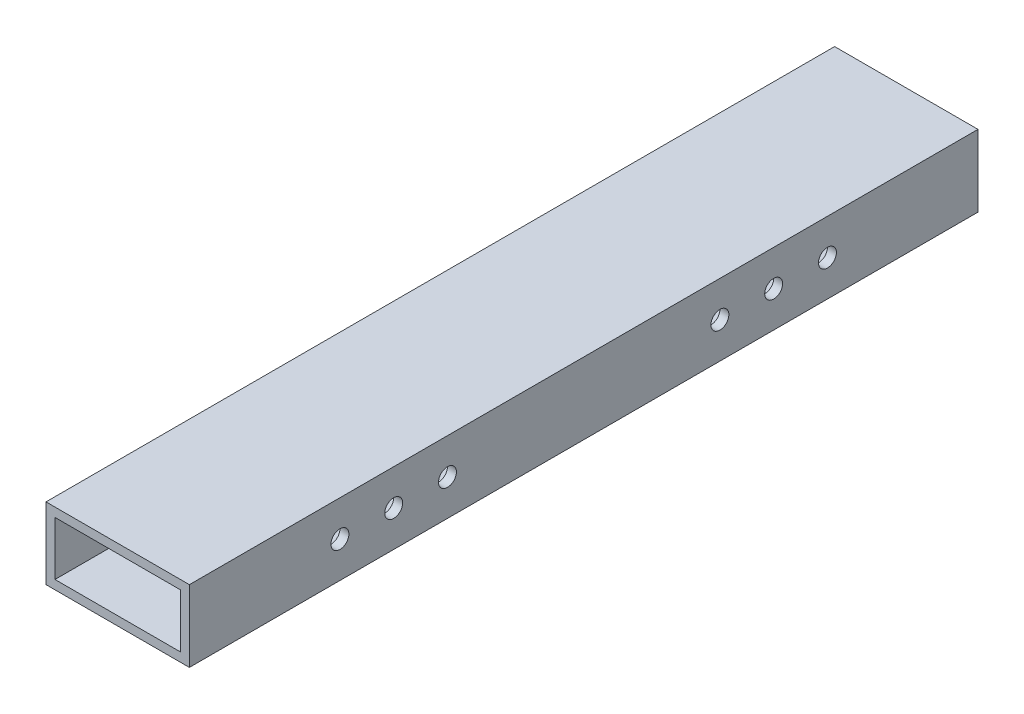
ISO-10303-21;
HEADER;
FILE_DESCRIPTION(('STEP AP214'),'2;1');
FILE_NAME('part.step','',(''),(''),'','','');
FILE_SCHEMA(('AUTOMOTIVE_DESIGN { 1 0 10303 214 1 1 1 1 }'));
ENDSEC;
DATA;
#1=APPLICATION_CONTEXT('core data for automotive mechanical design processes');
#2=APPLICATION_PROTOCOL_DEFINITION('international standard','automotive_design',2000,#1);
#3=PRODUCT_CONTEXT('',#1,'mechanical');
#4=PRODUCT('Part','Part','',(#3));
#5=PRODUCT_RELATED_PRODUCT_CATEGORY('part','',(#4));
#6=PRODUCT_DEFINITION_FORMATION('','',#4);
#7=PRODUCT_DEFINITION_CONTEXT('part definition',#1,'design');
#8=PRODUCT_DEFINITION('design','',#6,#7);
#9=PRODUCT_DEFINITION_SHAPE('','',#8);
#10=(LENGTH_UNIT() NAMED_UNIT(*) SI_UNIT(.MILLI.,.METRE.));
#11=(NAMED_UNIT(*) PLANE_ANGLE_UNIT() SI_UNIT($,.RADIAN.));
#12=(NAMED_UNIT(*) SI_UNIT($,.STERADIAN.) SOLID_ANGLE_UNIT());
#13=UNCERTAINTY_MEASURE_WITH_UNIT(LENGTH_MEASURE(1.E-05),#10,'distance_accuracy_value','');
#14=(GEOMETRIC_REPRESENTATION_CONTEXT(3) GLOBAL_UNCERTAINTY_ASSIGNED_CONTEXT((#13)) GLOBAL_UNIT_ASSIGNED_CONTEXT((#10,
#11,#12)) REPRESENTATION_CONTEXT('',''));
#15=CARTESIAN_POINT('',(0.,0.,0.));
#16=DIRECTION('',(0.,0.,1.));
#17=DIRECTION('',(1.,0.,0.));
#18=AXIS2_PLACEMENT_3D('',#15,#16,#17);
#19=CARTESIAN_POINT('',(0.,0.,279.4));
#20=DIRECTION('',(0.,0.,-1.));
#21=DIRECTION('',(-1.,0.,0.));
#22=AXIS2_PLACEMENT_3D('',#19,#20,#21);
#23=PLANE('',#22);
#24=DIRECTION('',(0.,-1.,0.));
#25=VECTOR('',#24,1.);
#26=CARTESIAN_POINT('',(0.,0.,279.4));
#27=LINE('',#26,#25);
#28=CARTESIAN_POINT('',(0.,25.4,279.4));
#29=VERTEX_POINT('',#28);
#30=CARTESIAN_POINT('',(0.,0.,279.4));
#31=VERTEX_POINT('',#30);
#32=EDGE_CURVE('E138',#29,#31,#27,.T.);
#33=ORIENTED_EDGE('',*,*,#32,.T.);
#34=DIRECTION('',(1.,0.,0.));
#35=VECTOR('',#34,1.);
#36=CARTESIAN_POINT('',(0.,0.,279.4));
#37=LINE('',#36,#35);
#38=CARTESIAN_POINT('',(50.8,0.,279.4));
#39=VERTEX_POINT('',#38);
#40=EDGE_CURVE('E141',#31,#39,#37,.T.);
#41=ORIENTED_EDGE('',*,*,#40,.T.);
#42=DIRECTION('',(0.,1.,0.));
#43=VECTOR('',#42,1.);
#44=CARTESIAN_POINT('',(50.8,0.,279.4));
#45=LINE('',#44,#43);
#46=CARTESIAN_POINT('',(50.8,25.4,279.4));
#47=VERTEX_POINT('',#46);
#48=EDGE_CURVE('E144',#39,#47,#45,.T.);
#49=ORIENTED_EDGE('',*,*,#48,.T.);
#50=DIRECTION('',(-1.,0.,0.));
#51=VECTOR('',#50,1.);
#52=CARTESIAN_POINT('',(0.,25.4,279.4));
#53=LINE('',#52,#51);
#54=EDGE_CURVE('E146',#47,#29,#53,.T.);
#55=ORIENTED_EDGE('',*,*,#54,.T.);
#56=EDGE_LOOP('',(#33,#41,#49,#55));
#57=FACE_BOUND('',#56,.T.);
#58=DIRECTION('',(0.,-1.,0.));
#59=VECTOR('',#58,1.);
#60=CARTESIAN_POINT('',(3.175,3.175,279.4));
#61=LINE('',#60,#59);
#62=CARTESIAN_POINT('',(3.175,22.225,279.4));
#63=VERTEX_POINT('',#62);
#64=CARTESIAN_POINT('',(3.175,3.175,279.4));
#65=VERTEX_POINT('',#64);
#66=EDGE_CURVE('E100',#63,#65,#61,.T.);
#67=ORIENTED_EDGE('',*,*,#66,.F.);
#68=DIRECTION('',(-1.,0.,0.));
#69=VECTOR('',#68,1.);
#70=CARTESIAN_POINT('',(3.175,22.225,279.4));
#71=LINE('',#70,#69);
#72=CARTESIAN_POINT('',(47.625,22.225,279.4));
#73=VERTEX_POINT('',#72);
#74=EDGE_CURVE('E122',#73,#63,#71,.T.);
#75=ORIENTED_EDGE('',*,*,#74,.F.);
#76=DIRECTION('',(0.,1.,0.));
#77=VECTOR('',#76,1.);
#78=CARTESIAN_POINT('',(47.625,3.175,279.4));
#79=LINE('',#78,#77);
#80=CARTESIAN_POINT('',(47.625,3.175,279.4));
#81=VERTEX_POINT('',#80);
#82=EDGE_CURVE('E120',#81,#73,#79,.T.);
#83=ORIENTED_EDGE('',*,*,#82,.F.);
#84=DIRECTION('',(1.,0.,0.));
#85=VECTOR('',#84,1.);
#86=CARTESIAN_POINT('',(3.175,3.175,279.4));
#87=LINE('',#86,#85);
#88=EDGE_CURVE('E108',#65,#81,#87,.T.);
#89=ORIENTED_EDGE('',*,*,#88,.F.);
#90=EDGE_LOOP('',(#67,#75,#83,#89));
#91=FACE_BOUND('',#90,.T.);
#92=ADVANCED_FACE('F33',(#57,#91),#23,.F.);
#93=CARTESIAN_POINT('',(0.,0.,0.));
#94=DIRECTION('',(0.,0.,-1.));
#95=DIRECTION('',(-1.,0.,0.));
#96=AXIS2_PLACEMENT_3D('',#93,#94,#95);
#97=PLANE('',#96);
#98=DIRECTION('',(0.,-1.,0.));
#99=VECTOR('',#98,1.);
#100=CARTESIAN_POINT('',(0.,0.,0.));
#101=LINE('',#100,#99);
#102=CARTESIAN_POINT('',(0.,25.4,0.));
#103=VERTEX_POINT('',#102);
#104=CARTESIAN_POINT('',(0.,0.,0.));
#105=VERTEX_POINT('',#104);
#106=EDGE_CURVE('E116',#103,#105,#101,.T.);
#107=ORIENTED_EDGE('',*,*,#106,.F.);
#108=DIRECTION('',(-1.,0.,0.));
#109=VECTOR('',#108,1.);
#110=CARTESIAN_POINT('',(0.,25.4,0.));
#111=LINE('',#110,#109);
#112=CARTESIAN_POINT('',(50.8,25.4,0.));
#113=VERTEX_POINT('',#112);
#114=EDGE_CURVE('E142',#113,#103,#111,.T.);
#115=ORIENTED_EDGE('',*,*,#114,.F.);
#116=DIRECTION('',(0.,1.,0.));
#117=VECTOR('',#116,1.);
#118=CARTESIAN_POINT('',(50.8,0.,0.));
#119=LINE('',#118,#117);
#120=CARTESIAN_POINT('',(50.8,0.,0.));
#121=VERTEX_POINT('',#120);
#122=EDGE_CURVE('E153',#121,#113,#119,.T.);
#123=ORIENTED_EDGE('',*,*,#122,.F.);
#124=DIRECTION('',(1.,0.,0.));
#125=VECTOR('',#124,1.);
#126=CARTESIAN_POINT('',(0.,0.,0.));
#127=LINE('',#126,#125);
#128=EDGE_CURVE('E151',#105,#121,#127,.T.);
#129=ORIENTED_EDGE('',*,*,#128,.F.);
#130=EDGE_LOOP('',(#107,#115,#123,#129));
#131=FACE_BOUND('',#130,.T.);
#132=DIRECTION('',(-1.,0.,0.));
#133=VECTOR('',#132,1.);
#134=CARTESIAN_POINT('',(3.175,22.225,0.));
#135=LINE('',#134,#133);
#136=CARTESIAN_POINT('',(47.625,22.225,0.));
#137=VERTEX_POINT('',#136);
#138=CARTESIAN_POINT('',(3.175,22.225,0.));
#139=VERTEX_POINT('',#138);
#140=EDGE_CURVE('E109',#137,#139,#135,.T.);
#141=ORIENTED_EDGE('',*,*,#140,.T.);
#142=DIRECTION('',(0.,-1.,0.));
#143=VECTOR('',#142,1.);
#144=CARTESIAN_POINT('',(3.175,3.175,0.));
#145=LINE('',#144,#143);
#146=CARTESIAN_POINT('',(3.175,3.175,0.));
#147=VERTEX_POINT('',#146);
#148=EDGE_CURVE('E58',#139,#147,#145,.T.);
#149=ORIENTED_EDGE('',*,*,#148,.T.);
#150=DIRECTION('',(1.,0.,0.));
#151=VECTOR('',#150,1.);
#152=CARTESIAN_POINT('',(3.175,3.175,0.));
#153=LINE('',#152,#151);
#154=CARTESIAN_POINT('',(47.625,3.175,0.));
#155=VERTEX_POINT('',#154);
#156=EDGE_CURVE('E115',#147,#155,#153,.T.);
#157=ORIENTED_EDGE('',*,*,#156,.T.);
#158=DIRECTION('',(0.,1.,0.));
#159=VECTOR('',#158,1.);
#160=CARTESIAN_POINT('',(47.625,3.175,0.));
#161=LINE('',#160,#159);
#162=EDGE_CURVE('E130',#155,#137,#161,.T.);
#163=ORIENTED_EDGE('',*,*,#162,.T.);
#164=EDGE_LOOP('',(#141,#149,#157,#163));
#165=FACE_BOUND('',#164,.T.);
#166=ADVANCED_FACE('F250',(#131,#165),#97,.T.);
#167=CARTESIAN_POINT('',(0.,0.,279.4));
#168=DIRECTION('',(1.,0.,0.));
#169=DIRECTION('',(0.,0.,-1.));
#170=AXIS2_PLACEMENT_3D('',#167,#168,#169);
#171=PLANE('',#170);
#172=CARTESIAN_POINT('',(0.,12.7,72.39));
#173=DIRECTION('',(1.,0.,0.));
#174=DIRECTION('',(0.,0.,1.));
#175=AXIS2_PLACEMENT_3D('',#172,#173,#174);
#176=CIRCLE('',#175,3.175);
#177=CARTESIAN_POINT('',(0.,12.7,75.565));
#178=VERTEX_POINT('',#177);
#179=EDGE_CURVE('E330',#178,#178,#176,.T.);
#180=ORIENTED_EDGE('',*,*,#179,.T.);
#181=EDGE_LOOP('',(#180));
#182=FACE_BOUND('',#181,.T.);
#183=CARTESIAN_POINT('',(0.,12.7,53.34));
#184=DIRECTION('',(1.,0.,0.));
#185=DIRECTION('',(0.,0.,1.));
#186=AXIS2_PLACEMENT_3D('',#183,#184,#185);
#187=CIRCLE('',#186,3.175);
#188=CARTESIAN_POINT('',(0.,12.7,56.515));
#189=VERTEX_POINT('',#188);
#190=EDGE_CURVE('E184',#189,#189,#187,.T.);
#191=ORIENTED_EDGE('',*,*,#190,.T.);
#192=EDGE_LOOP('',(#191));
#193=FACE_BOUND('',#192,.T.);
#194=CARTESIAN_POINT('',(0.,12.7,91.44));
#195=DIRECTION('',(1.,0.,0.));
#196=DIRECTION('',(0.,0.,1.));
#197=AXIS2_PLACEMENT_3D('',#194,#195,#196);
#198=CIRCLE('',#197,3.175);
#199=CARTESIAN_POINT('',(0.,12.7,94.615));
#200=VERTEX_POINT('',#199);
#201=EDGE_CURVE('E180',#200,#200,#198,.T.);
#202=ORIENTED_EDGE('',*,*,#201,.T.);
#203=EDGE_LOOP('',(#202));
#204=FACE_BOUND('',#203,.T.);
#205=CARTESIAN_POINT('',(0.,12.7,207.01));
#206=DIRECTION('',(1.,0.,0.));
#207=DIRECTION('',(0.,0.,-1.));
#208=AXIS2_PLACEMENT_3D('',#205,#206,#207);
#209=CIRCLE('',#208,3.175);
#210=CARTESIAN_POINT('',(0.,12.7,203.835));
#211=VERTEX_POINT('',#210);
#212=EDGE_CURVE('E176',#211,#211,#209,.T.);
#213=ORIENTED_EDGE('',*,*,#212,.T.);
#214=EDGE_LOOP('',(#213));
#215=FACE_BOUND('',#214,.T.);
#216=CARTESIAN_POINT('',(0.,12.7,187.96));
#217=DIRECTION('',(1.,0.,0.));
#218=DIRECTION('',(0.,0.,-1.));
#219=AXIS2_PLACEMENT_3D('',#216,#217,#218);
#220=CIRCLE('',#219,3.175);
#221=CARTESIAN_POINT('',(0.,12.7,184.785));
#222=VERTEX_POINT('',#221);
#223=EDGE_CURVE('E171',#222,#222,#220,.T.);
#224=ORIENTED_EDGE('',*,*,#223,.T.);
#225=EDGE_LOOP('',(#224));
#226=FACE_BOUND('',#225,.T.);
#227=CARTESIAN_POINT('',(0.,12.7,226.06));
#228=DIRECTION('',(1.,0.,0.));
#229=DIRECTION('',(0.,0.,-1.));
#230=AXIS2_PLACEMENT_3D('',#227,#228,#229);
#231=CIRCLE('',#230,3.175);
#232=CARTESIAN_POINT('',(0.,12.7,222.885));
#233=VERTEX_POINT('',#232);
#234=EDGE_CURVE('E166',#233,#233,#231,.T.);
#235=ORIENTED_EDGE('',*,*,#234,.T.);
#236=EDGE_LOOP('',(#235));
#237=FACE_BOUND('',#236,.T.);
#238=ORIENTED_EDGE('',*,*,#106,.T.);
#239=DIRECTION('',(0.,0.,-1.));
#240=VECTOR('',#239,1.);
#241=CARTESIAN_POINT('',(0.,0.,279.4));
#242=LINE('',#241,#240);
#243=EDGE_CURVE('E11',#31,#105,#242,.T.);
#244=ORIENTED_EDGE('',*,*,#243,.F.);
#245=ORIENTED_EDGE('',*,*,#32,.F.);
#246=DIRECTION('',(0.,0.,-1.));
#247=VECTOR('',#246,1.);
#248=CARTESIAN_POINT('',(0.,25.4,279.4));
#249=LINE('',#248,#247);
#250=EDGE_CURVE('E148',#29,#103,#249,.T.);
#251=ORIENTED_EDGE('',*,*,#250,.T.);
#252=EDGE_LOOP('',(#238,#244,#245,#251));
#253=FACE_BOUND('',#252,.T.);
#254=ADVANCED_FACE('F35',(#182,#193,#204,#215,#226,#237,#253),#171,.F.);
#255=CARTESIAN_POINT('',(0.,0.,279.4));
#256=DIRECTION('',(0.,1.,0.));
#257=DIRECTION('',(0.,0.,1.));
#258=AXIS2_PLACEMENT_3D('',#255,#256,#257);
#259=PLANE('',#258);
#260=ORIENTED_EDGE('',*,*,#128,.T.);
#261=DIRECTION('',(0.,0.,-1.));
#262=VECTOR('',#261,1.);
#263=CARTESIAN_POINT('',(50.8,0.,279.4));
#264=LINE('',#263,#262);
#265=EDGE_CURVE('E42',#39,#121,#264,.T.);
#266=ORIENTED_EDGE('',*,*,#265,.F.);
#267=ORIENTED_EDGE('',*,*,#40,.F.);
#268=ORIENTED_EDGE('',*,*,#243,.T.);
#269=EDGE_LOOP('',(#260,#266,#267,#268));
#270=FACE_BOUND('',#269,.T.);
#271=ADVANCED_FACE('F258',(#270),#259,.F.);
#272=CARTESIAN_POINT('',(50.8,0.,279.4));
#273=DIRECTION('',(-1.,0.,0.));
#274=DIRECTION('',(0.,0.,1.));
#275=AXIS2_PLACEMENT_3D('',#272,#273,#274);
#276=PLANE('',#275);
#277=CARTESIAN_POINT('',(50.8,12.7,72.39));
#278=DIRECTION('',(1.,0.,0.));
#279=DIRECTION('',(0.,0.,1.));
#280=AXIS2_PLACEMENT_3D('',#277,#278,#279);
#281=CIRCLE('',#280,3.175);
#282=CARTESIAN_POINT('',(50.8,12.7,75.565));
#283=VERTEX_POINT('',#282);
#284=EDGE_CURVE('E329',#283,#283,#281,.T.);
#285=ORIENTED_EDGE('',*,*,#284,.F.);
#286=EDGE_LOOP('',(#285));
#287=FACE_BOUND('',#286,.T.);
#288=CARTESIAN_POINT('',(50.8,12.7,53.34));
#289=DIRECTION('',(1.,0.,0.));
#290=DIRECTION('',(0.,0.,1.));
#291=AXIS2_PLACEMENT_3D('',#288,#289,#290);
#292=CIRCLE('',#291,3.175);
#293=CARTESIAN_POINT('',(50.8,12.7,56.515));
#294=VERTEX_POINT('',#293);
#295=EDGE_CURVE('E191',#294,#294,#292,.T.);
#296=ORIENTED_EDGE('',*,*,#295,.F.);
#297=EDGE_LOOP('',(#296));
#298=FACE_BOUND('',#297,.T.);
#299=CARTESIAN_POINT('',(50.8,12.7,91.44));
#300=DIRECTION('',(1.,0.,0.));
#301=DIRECTION('',(0.,0.,1.));
#302=AXIS2_PLACEMENT_3D('',#299,#300,#301);
#303=CIRCLE('',#302,3.175);
#304=CARTESIAN_POINT('',(50.8,12.7,94.615));
#305=VERTEX_POINT('',#304);
#306=EDGE_CURVE('E188',#305,#305,#303,.T.);
#307=ORIENTED_EDGE('',*,*,#306,.F.);
#308=EDGE_LOOP('',(#307));
#309=FACE_BOUND('',#308,.T.);
#310=CARTESIAN_POINT('',(50.8,12.7,207.01));
#311=DIRECTION('',(1.,0.,0.));
#312=DIRECTION('',(0.,0.,-1.));
#313=AXIS2_PLACEMENT_3D('',#310,#311,#312);
#314=CIRCLE('',#313,3.175);
#315=CARTESIAN_POINT('',(50.8,12.7,203.835));
#316=VERTEX_POINT('',#315);
#317=EDGE_CURVE('E207',#316,#316,#314,.T.);
#318=ORIENTED_EDGE('',*,*,#317,.F.);
#319=EDGE_LOOP('',(#318));
#320=FACE_BOUND('',#319,.T.);
#321=CARTESIAN_POINT('',(50.8,12.7,187.96));
#322=DIRECTION('',(1.,0.,0.));
#323=DIRECTION('',(0.,0.,-1.));
#324=AXIS2_PLACEMENT_3D('',#321,#322,#323);
#325=CIRCLE('',#324,3.175);
#326=CARTESIAN_POINT('',(50.8,12.7,184.785));
#327=VERTEX_POINT('',#326);
#328=EDGE_CURVE('E214',#327,#327,#325,.T.);
#329=ORIENTED_EDGE('',*,*,#328,.F.);
#330=EDGE_LOOP('',(#329));
#331=FACE_BOUND('',#330,.T.);
#332=CARTESIAN_POINT('',(50.8,12.7,226.06));
#333=DIRECTION('',(1.,0.,0.));
#334=DIRECTION('',(0.,0.,-1.));
#335=AXIS2_PLACEMENT_3D('',#332,#333,#334);
#336=CIRCLE('',#335,3.175);
#337=CARTESIAN_POINT('',(50.8,12.7,222.885));
#338=VERTEX_POINT('',#337);
#339=EDGE_CURVE('E221',#338,#338,#336,.T.);
#340=ORIENTED_EDGE('',*,*,#339,.F.);
#341=EDGE_LOOP('',(#340));
#342=FACE_BOUND('',#341,.T.);
#343=ORIENTED_EDGE('',*,*,#122,.T.);
#344=DIRECTION('',(0.,0.,-1.));
#345=VECTOR('',#344,1.);
#346=CARTESIAN_POINT('',(50.8,25.4,279.4));
#347=LINE('',#346,#345);
#348=EDGE_CURVE('E158',#47,#113,#347,.T.);
#349=ORIENTED_EDGE('',*,*,#348,.F.);
#350=ORIENTED_EDGE('',*,*,#48,.F.);
#351=ORIENTED_EDGE('',*,*,#265,.T.);
#352=EDGE_LOOP('',(#343,#349,#350,#351));
#353=FACE_BOUND('',#352,.T.);
#354=ADVANCED_FACE('F243',(#287,#298,#309,#320,#331,#342,#353),#276,.F.);
#355=CARTESIAN_POINT('',(0.,25.4,279.4));
#356=DIRECTION('',(0.,-1.,0.));
#357=DIRECTION('',(0.,0.,-1.));
#358=AXIS2_PLACEMENT_3D('',#355,#356,#357);
#359=PLANE('',#358);
#360=ORIENTED_EDGE('',*,*,#114,.T.);
#361=ORIENTED_EDGE('',*,*,#250,.F.);
#362=ORIENTED_EDGE('',*,*,#54,.F.);
#363=ORIENTED_EDGE('',*,*,#348,.T.);
#364=EDGE_LOOP('',(#360,#361,#362,#363));
#365=FACE_BOUND('',#364,.T.);
#366=ADVANCED_FACE('F232',(#365),#359,.F.);
#367=CARTESIAN_POINT('',(3.175,3.175,279.4));
#368=DIRECTION('',(1.,0.,0.));
#369=DIRECTION('',(0.,0.,-1.));
#370=AXIS2_PLACEMENT_3D('',#367,#368,#369);
#371=PLANE('',#370);
#372=CARTESIAN_POINT('',(3.175,12.7,72.39));
#373=DIRECTION('',(1.,0.,0.));
#374=DIRECTION('',(0.,0.,-1.));
#375=AXIS2_PLACEMENT_3D('',#372,#373,#374);
#376=CIRCLE('',#375,3.175);
#377=CARTESIAN_POINT('',(3.175,12.7,69.215));
#378=VERTEX_POINT('',#377);
#379=EDGE_CURVE('E196',#378,#378,#376,.T.);
#380=ORIENTED_EDGE('',*,*,#379,.F.);
#381=EDGE_LOOP('',(#380));
#382=FACE_BOUND('',#381,.T.);
#383=CARTESIAN_POINT('',(3.175,12.7,53.34));
#384=DIRECTION('',(1.,0.,0.));
#385=DIRECTION('',(0.,0.,-1.));
#386=AXIS2_PLACEMENT_3D('',#383,#384,#385);
#387=CIRCLE('',#386,3.175);
#388=CARTESIAN_POINT('',(3.175,12.7,50.165));
#389=VERTEX_POINT('',#388);
#390=EDGE_CURVE('E183',#389,#389,#387,.T.);
#391=ORIENTED_EDGE('',*,*,#390,.F.);
#392=EDGE_LOOP('',(#391));
#393=FACE_BOUND('',#392,.T.);
#394=CARTESIAN_POINT('',(3.175,12.7,91.44));
#395=DIRECTION('',(1.,0.,0.));
#396=DIRECTION('',(0.,0.,-1.));
#397=AXIS2_PLACEMENT_3D('',#394,#395,#396);
#398=CIRCLE('',#397,3.175);
#399=CARTESIAN_POINT('',(3.175,12.7,88.265));
#400=VERTEX_POINT('',#399);
#401=EDGE_CURVE('E179',#400,#400,#398,.T.);
#402=ORIENTED_EDGE('',*,*,#401,.F.);
#403=EDGE_LOOP('',(#402));
#404=FACE_BOUND('',#403,.T.);
#405=CARTESIAN_POINT('',(3.175,12.7,207.01));
#406=DIRECTION('',(1.,0.,0.));
#407=DIRECTION('',(0.,0.,-1.));
#408=AXIS2_PLACEMENT_3D('',#405,#406,#407);
#409=CIRCLE('',#408,3.175);
#410=CARTESIAN_POINT('',(3.175,12.7,203.835));
#411=VERTEX_POINT('',#410);
#412=EDGE_CURVE('E175',#411,#411,#409,.T.);
#413=ORIENTED_EDGE('',*,*,#412,.F.);
#414=EDGE_LOOP('',(#413));
#415=FACE_BOUND('',#414,.T.);
#416=CARTESIAN_POINT('',(3.175,12.7,187.96));
#417=DIRECTION('',(1.,0.,0.));
#418=DIRECTION('',(0.,0.,-1.));
#419=AXIS2_PLACEMENT_3D('',#416,#417,#418);
#420=CIRCLE('',#419,3.175);
#421=CARTESIAN_POINT('',(3.175,12.7,184.785));
#422=VERTEX_POINT('',#421);
#423=EDGE_CURVE('E170',#422,#422,#420,.T.);
#424=ORIENTED_EDGE('',*,*,#423,.F.);
#425=EDGE_LOOP('',(#424));
#426=FACE_BOUND('',#425,.T.);
#427=CARTESIAN_POINT('',(3.175,12.7,226.06));
#428=DIRECTION('',(1.,0.,0.));
#429=DIRECTION('',(0.,0.,-1.));
#430=AXIS2_PLACEMENT_3D('',#427,#428,#429);
#431=CIRCLE('',#430,3.175);
#432=CARTESIAN_POINT('',(3.175,12.7,222.885));
#433=VERTEX_POINT('',#432);
#434=EDGE_CURVE('E128',#433,#433,#431,.T.);
#435=ORIENTED_EDGE('',*,*,#434,.F.);
#436=EDGE_LOOP('',(#435));
#437=FACE_BOUND('',#436,.T.);
#438=ORIENTED_EDGE('',*,*,#148,.F.);
#439=DIRECTION('',(0.,0.,-1.));
#440=VECTOR('',#439,1.);
#441=CARTESIAN_POINT('',(3.175,22.225,279.4));
#442=LINE('',#441,#440);
#443=EDGE_CURVE('E104',#63,#139,#442,.T.);
#444=ORIENTED_EDGE('',*,*,#443,.F.);
#445=ORIENTED_EDGE('',*,*,#66,.T.);
#446=DIRECTION('',(0.,0.,-1.));
#447=VECTOR('',#446,1.);
#448=CARTESIAN_POINT('',(3.175,3.175,279.4));
#449=LINE('',#448,#447);
#450=EDGE_CURVE('E103',#65,#147,#449,.T.);
#451=ORIENTED_EDGE('',*,*,#450,.T.);
#452=EDGE_LOOP('',(#438,#444,#445,#451));
#453=FACE_BOUND('',#452,.T.);
#454=ADVANCED_FACE('F102',(#382,#393,#404,#415,#426,#437,#453),#371,.T.);
#455=CARTESIAN_POINT('',(3.175,3.175,279.4));
#456=DIRECTION('',(0.,1.,0.));
#457=DIRECTION('',(0.,0.,1.));
#458=AXIS2_PLACEMENT_3D('',#455,#456,#457);
#459=PLANE('',#458);
#460=ORIENTED_EDGE('',*,*,#156,.F.);
#461=ORIENTED_EDGE('',*,*,#450,.F.);
#462=ORIENTED_EDGE('',*,*,#88,.T.);
#463=DIRECTION('',(0.,0.,-1.));
#464=VECTOR('',#463,1.);
#465=CARTESIAN_POINT('',(47.625,3.175,279.4));
#466=LINE('',#465,#464);
#467=EDGE_CURVE('E117',#81,#155,#466,.T.);
#468=ORIENTED_EDGE('',*,*,#467,.T.);
#469=EDGE_LOOP('',(#460,#461,#462,#468));
#470=FACE_BOUND('',#469,.T.);
#471=ADVANCED_FACE('F112',(#470),#459,.T.);
#472=CARTESIAN_POINT('',(47.625,3.175,279.4));
#473=DIRECTION('',(-1.,0.,0.));
#474=DIRECTION('',(0.,0.,1.));
#475=AXIS2_PLACEMENT_3D('',#472,#473,#474);
#476=PLANE('',#475);
#477=CARTESIAN_POINT('',(47.625,12.7,72.39));
#478=DIRECTION('',(-1.,0.,0.));
#479=DIRECTION('',(0.,0.,1.));
#480=AXIS2_PLACEMENT_3D('',#477,#478,#479);
#481=CIRCLE('',#480,3.175);
#482=CARTESIAN_POINT('',(47.625,12.7,75.565));
#483=VERTEX_POINT('',#482);
#484=EDGE_CURVE('E37',#483,#483,#481,.T.);
#485=ORIENTED_EDGE('',*,*,#484,.F.);
#486=EDGE_LOOP('',(#485));
#487=FACE_BOUND('',#486,.T.);
#488=CARTESIAN_POINT('',(47.625,12.7,53.34));
#489=DIRECTION('',(-1.,0.,0.));
#490=DIRECTION('',(0.,0.,1.));
#491=AXIS2_PLACEMENT_3D('',#488,#489,#490);
#492=CIRCLE('',#491,3.175);
#493=CARTESIAN_POINT('',(47.625,12.7,56.515));
#494=VERTEX_POINT('',#493);
#495=EDGE_CURVE('E181',#494,#494,#492,.T.);
#496=ORIENTED_EDGE('',*,*,#495,.F.);
#497=EDGE_LOOP('',(#496));
#498=FACE_BOUND('',#497,.T.);
#499=CARTESIAN_POINT('',(47.625,12.7,91.44));
#500=DIRECTION('',(-1.,0.,0.));
#501=DIRECTION('',(0.,0.,1.));
#502=AXIS2_PLACEMENT_3D('',#499,#500,#501);
#503=CIRCLE('',#502,3.175);
#504=CARTESIAN_POINT('',(47.625,12.7,94.615));
#505=VERTEX_POINT('',#504);
#506=EDGE_CURVE('E177',#505,#505,#503,.T.);
#507=ORIENTED_EDGE('',*,*,#506,.F.);
#508=EDGE_LOOP('',(#507));
#509=FACE_BOUND('',#508,.T.);
#510=CARTESIAN_POINT('',(47.625,12.7,207.01));
#511=DIRECTION('',(-1.,0.,0.));
#512=DIRECTION('',(0.,0.,1.));
#513=AXIS2_PLACEMENT_3D('',#510,#511,#512);
#514=CIRCLE('',#513,3.175);
#515=CARTESIAN_POINT('',(47.625,12.7,210.185));
#516=VERTEX_POINT('',#515);
#517=EDGE_CURVE('E172',#516,#516,#514,.T.);
#518=ORIENTED_EDGE('',*,*,#517,.F.);
#519=EDGE_LOOP('',(#518));
#520=FACE_BOUND('',#519,.T.);
#521=CARTESIAN_POINT('',(47.625,12.7,187.96));
#522=DIRECTION('',(-1.,0.,0.));
#523=DIRECTION('',(0.,0.,1.));
#524=AXIS2_PLACEMENT_3D('',#521,#522,#523);
#525=CIRCLE('',#524,3.175);
#526=CARTESIAN_POINT('',(47.625,12.7,191.135));
#527=VERTEX_POINT('',#526);
#528=EDGE_CURVE('E167',#527,#527,#525,.T.);
#529=ORIENTED_EDGE('',*,*,#528,.F.);
#530=EDGE_LOOP('',(#529));
#531=FACE_BOUND('',#530,.T.);
#532=CARTESIAN_POINT('',(47.625,12.7,226.06));
#533=DIRECTION('',(-1.,0.,0.));
#534=DIRECTION('',(0.,0.,1.));
#535=AXIS2_PLACEMENT_3D('',#532,#533,#534);
#536=CIRCLE('',#535,3.175);
#537=CARTESIAN_POINT('',(47.625,12.7,229.235));
#538=VERTEX_POINT('',#537);
#539=EDGE_CURVE('E163',#538,#538,#536,.T.);
#540=ORIENTED_EDGE('',*,*,#539,.F.);
#541=EDGE_LOOP('',(#540));
#542=FACE_BOUND('',#541,.T.);
#543=ORIENTED_EDGE('',*,*,#162,.F.);
#544=ORIENTED_EDGE('',*,*,#467,.F.);
#545=ORIENTED_EDGE('',*,*,#82,.T.);
#546=DIRECTION('',(0.,0.,-1.));
#547=VECTOR('',#546,1.);
#548=CARTESIAN_POINT('',(47.625,22.225,279.4));
#549=LINE('',#548,#547);
#550=EDGE_CURVE('E50',#73,#137,#549,.T.);
#551=ORIENTED_EDGE('',*,*,#550,.T.);
#552=EDGE_LOOP('',(#543,#544,#545,#551));
#553=FACE_BOUND('',#552,.T.);
#554=ADVANCED_FACE('F240',(#487,#498,#509,#520,#531,#542,#553),#476,.T.);
#555=CARTESIAN_POINT('',(3.175,22.225,279.4));
#556=DIRECTION('',(0.,-1.,0.));
#557=DIRECTION('',(0.,0.,-1.));
#558=AXIS2_PLACEMENT_3D('',#555,#556,#557);
#559=PLANE('',#558);
#560=ORIENTED_EDGE('',*,*,#140,.F.);
#561=ORIENTED_EDGE('',*,*,#550,.F.);
#562=ORIENTED_EDGE('',*,*,#74,.T.);
#563=ORIENTED_EDGE('',*,*,#443,.T.);
#564=EDGE_LOOP('',(#560,#561,#562,#563));
#565=FACE_BOUND('',#564,.T.);
#566=ADVANCED_FACE('F282',(#565),#559,.T.);
#567=CARTESIAN_POINT('',(0.,12.7,226.06));
#568=DIRECTION('',(1.,0.,0.));
#569=DIRECTION('',(0.,0.,-1.));
#570=AXIS2_PLACEMENT_3D('',#567,#568,#569);
#571=CYLINDRICAL_SURFACE('',#570,3.175);
#572=ORIENTED_EDGE('',*,*,#539,.T.);
#573=EDGE_LOOP('',(#572));
#574=FACE_BOUND('',#573,.T.);
#575=ORIENTED_EDGE('',*,*,#339,.T.);
#576=EDGE_LOOP('',(#575));
#577=FACE_BOUND('',#576,.T.);
#578=ADVANCED_FACE('F284',(#574,#577),#571,.F.);
#579=ORIENTED_EDGE('',*,*,#434,.T.);
#580=EDGE_LOOP('',(#579));
#581=FACE_BOUND('',#580,.T.);
#582=ORIENTED_EDGE('',*,*,#234,.F.);
#583=EDGE_LOOP('',(#582));
#584=FACE_BOUND('',#583,.T.);
#585=ADVANCED_FACE('F228',(#581,#584),#571,.F.);
#586=CARTESIAN_POINT('',(0.,12.7,187.96));
#587=DIRECTION('',(1.,0.,0.));
#588=DIRECTION('',(0.,0.,-1.));
#589=AXIS2_PLACEMENT_3D('',#586,#587,#588);
#590=CYLINDRICAL_SURFACE('',#589,3.175);
#591=ORIENTED_EDGE('',*,*,#528,.T.);
#592=EDGE_LOOP('',(#591));
#593=FACE_BOUND('',#592,.T.);
#594=ORIENTED_EDGE('',*,*,#328,.T.);
#595=EDGE_LOOP('',(#594));
#596=FACE_BOUND('',#595,.T.);
#597=ADVANCED_FACE('F295',(#593,#596),#590,.F.);
#598=ORIENTED_EDGE('',*,*,#423,.T.);
#599=EDGE_LOOP('',(#598));
#600=FACE_BOUND('',#599,.T.);
#601=ORIENTED_EDGE('',*,*,#223,.F.);
#602=EDGE_LOOP('',(#601));
#603=FACE_BOUND('',#602,.T.);
#604=ADVANCED_FACE('F298',(#600,#603),#590,.F.);
#605=CARTESIAN_POINT('',(0.,12.7,207.01));
#606=DIRECTION('',(1.,0.,0.));
#607=DIRECTION('',(0.,0.,-1.));
#608=AXIS2_PLACEMENT_3D('',#605,#606,#607);
#609=CYLINDRICAL_SURFACE('',#608,3.175);
#610=ORIENTED_EDGE('',*,*,#517,.T.);
#611=EDGE_LOOP('',(#610));
#612=FACE_BOUND('',#611,.T.);
#613=ORIENTED_EDGE('',*,*,#317,.T.);
#614=EDGE_LOOP('',(#613));
#615=FACE_BOUND('',#614,.T.);
#616=ADVANCED_FACE('F300',(#612,#615),#609,.F.);
#617=ORIENTED_EDGE('',*,*,#412,.T.);
#618=EDGE_LOOP('',(#617));
#619=FACE_BOUND('',#618,.T.);
#620=ORIENTED_EDGE('',*,*,#212,.F.);
#621=EDGE_LOOP('',(#620));
#622=FACE_BOUND('',#621,.T.);
#623=ADVANCED_FACE('F303',(#619,#622),#609,.F.);
#624=CARTESIAN_POINT('',(0.,12.7,91.44));
#625=DIRECTION('',(1.,0.,0.));
#626=DIRECTION('',(0.,0.,-1.));
#627=AXIS2_PLACEMENT_3D('',#624,#625,#626);
#628=CYLINDRICAL_SURFACE('',#627,3.175);
#629=ORIENTED_EDGE('',*,*,#506,.T.);
#630=EDGE_LOOP('',(#629));
#631=FACE_BOUND('',#630,.T.);
#632=ORIENTED_EDGE('',*,*,#306,.T.);
#633=EDGE_LOOP('',(#632));
#634=FACE_BOUND('',#633,.T.);
#635=ADVANCED_FACE('F305',(#631,#634),#628,.F.);
#636=ORIENTED_EDGE('',*,*,#401,.T.);
#637=EDGE_LOOP('',(#636));
#638=FACE_BOUND('',#637,.T.);
#639=ORIENTED_EDGE('',*,*,#201,.F.);
#640=EDGE_LOOP('',(#639));
#641=FACE_BOUND('',#640,.T.);
#642=ADVANCED_FACE('F308',(#638,#641),#628,.F.);
#643=CARTESIAN_POINT('',(0.,12.7,53.34));
#644=DIRECTION('',(1.,0.,0.));
#645=DIRECTION('',(0.,0.,-1.));
#646=AXIS2_PLACEMENT_3D('',#643,#644,#645);
#647=CYLINDRICAL_SURFACE('',#646,3.175);
#648=ORIENTED_EDGE('',*,*,#495,.T.);
#649=EDGE_LOOP('',(#648));
#650=FACE_BOUND('',#649,.T.);
#651=ORIENTED_EDGE('',*,*,#295,.T.);
#652=EDGE_LOOP('',(#651));
#653=FACE_BOUND('',#652,.T.);
#654=ADVANCED_FACE('F310',(#650,#653),#647,.F.);
#655=ORIENTED_EDGE('',*,*,#390,.T.);
#656=EDGE_LOOP('',(#655));
#657=FACE_BOUND('',#656,.T.);
#658=ORIENTED_EDGE('',*,*,#190,.F.);
#659=EDGE_LOOP('',(#658));
#660=FACE_BOUND('',#659,.T.);
#661=ADVANCED_FACE('F313',(#657,#660),#647,.F.);
#662=CARTESIAN_POINT('',(0.,12.7,72.39));
#663=DIRECTION('',(1.,0.,0.));
#664=DIRECTION('',(0.,0.,-1.));
#665=AXIS2_PLACEMENT_3D('',#662,#663,#664);
#666=CYLINDRICAL_SURFACE('',#665,3.175);
#667=ORIENTED_EDGE('',*,*,#484,.T.);
#668=EDGE_LOOP('',(#667));
#669=FACE_BOUND('',#668,.T.);
#670=ORIENTED_EDGE('',*,*,#284,.T.);
#671=EDGE_LOOP('',(#670));
#672=FACE_BOUND('',#671,.T.);
#673=ADVANCED_FACE('F314',(#669,#672),#666,.F.);
#674=ORIENTED_EDGE('',*,*,#379,.T.);
#675=EDGE_LOOP('',(#674));
#676=FACE_BOUND('',#675,.T.);
#677=ORIENTED_EDGE('',*,*,#179,.F.);
#678=EDGE_LOOP('',(#677));
#679=FACE_BOUND('',#678,.T.);
#680=ADVANCED_FACE('F316',(#676,#679),#666,.F.);
#681=CLOSED_SHELL('',(#92,#166,#254,#271,#354,#366,#454,#471,#554,#566,#578,#585,#597,#604,#616,
#623,#635,#642,#654,#661,#673,#680));
#682=MANIFOLD_SOLID_BREP('B2',#681);
#683=ADVANCED_BREP_SHAPE_REPRESENTATION('',(#18,#682),#14);
#684=SHAPE_DEFINITION_REPRESENTATION(#9,#683);
ENDSEC;
END-ISO-10303-21;
